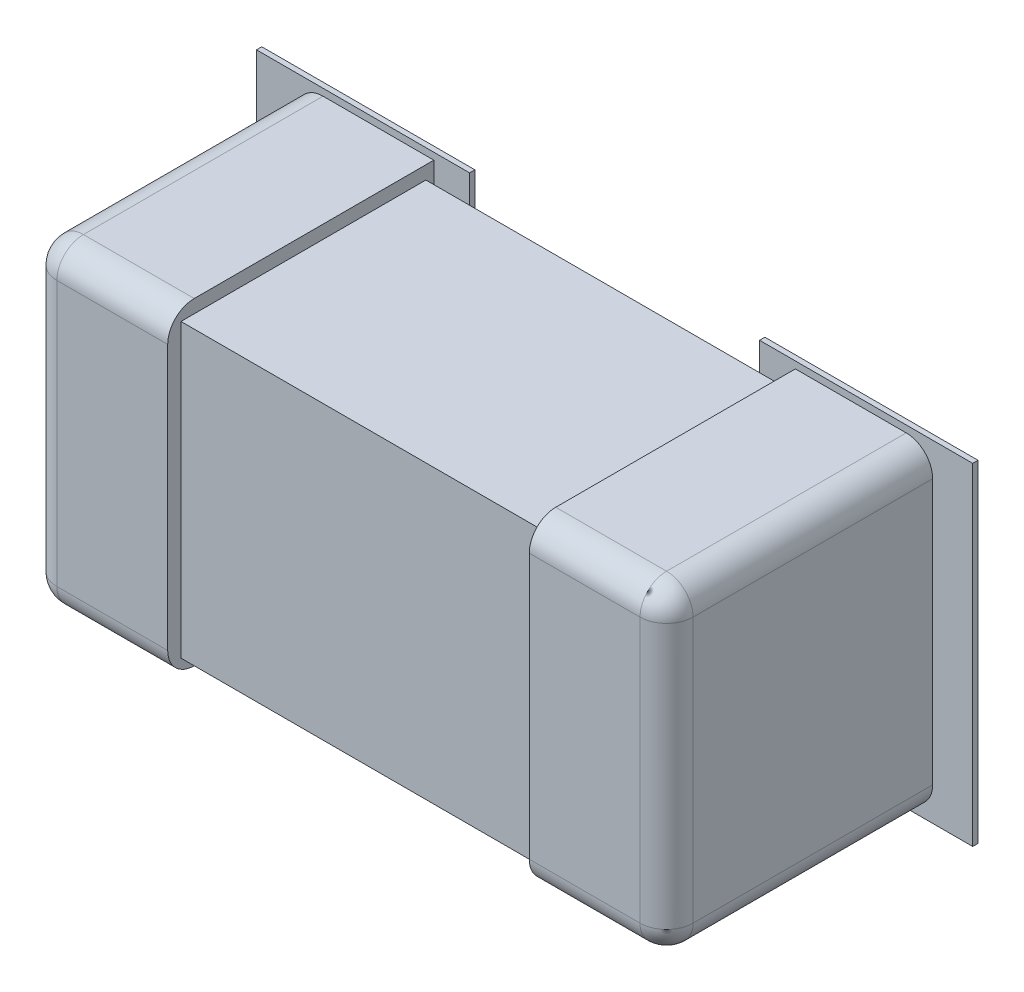
ISO-10303-21;
HEADER;
FILE_DESCRIPTION(('STEP AP214'),'2;1');
FILE_NAME('part.step','',(''),(''),'','','');
FILE_SCHEMA(('AUTOMOTIVE_DESIGN { 1 0 10303 214 1 1 1 1 }'));
ENDSEC;
DATA;
#1=APPLICATION_CONTEXT('core data for automotive mechanical design processes');
#2=APPLICATION_PROTOCOL_DEFINITION('international standard','automotive_design',2000,#1);
#3=PRODUCT_CONTEXT('',#1,'mechanical');
#4=PRODUCT('Part','Part','',(#3));
#5=PRODUCT_RELATED_PRODUCT_CATEGORY('part','',(#4));
#6=PRODUCT_DEFINITION_FORMATION('','',#4);
#7=PRODUCT_DEFINITION_CONTEXT('part definition',#1,'design');
#8=PRODUCT_DEFINITION('design','',#6,#7);
#9=PRODUCT_DEFINITION_SHAPE('','',#8);
#10=(LENGTH_UNIT() NAMED_UNIT(*) SI_UNIT(.MILLI.,.METRE.));
#11=(NAMED_UNIT(*) PLANE_ANGLE_UNIT() SI_UNIT($,.RADIAN.));
#12=(NAMED_UNIT(*) SI_UNIT($,.STERADIAN.) SOLID_ANGLE_UNIT());
#13=UNCERTAINTY_MEASURE_WITH_UNIT(LENGTH_MEASURE(1.E-05),#10,'distance_accuracy_value','');
#14=(GEOMETRIC_REPRESENTATION_CONTEXT(3) GLOBAL_UNCERTAINTY_ASSIGNED_CONTEXT((#13)) GLOBAL_UNIT_ASSIGNED_CONTEXT((#10,
#11,#12)) REPRESENTATION_CONTEXT('',''));
#15=CARTESIAN_POINT('',(0.,0.,0.));
#16=DIRECTION('',(0.,0.,1.));
#17=DIRECTION('',(1.,0.,0.));
#18=AXIS2_PLACEMENT_3D('',#15,#16,#17);
#19=CARTESIAN_POINT('',(0.,0.,0.0762));
#20=DIRECTION('',(0.,0.,1.));
#21=DIRECTION('',(1.,0.,0.));
#22=AXIS2_PLACEMENT_3D('',#19,#20,#21);
#23=PLANE('',#22);
#24=DIRECTION('',(1.,0.,0.));
#25=VECTOR('',#24,1.);
#26=CARTESIAN_POINT('',(0.138938,-0.159004,0.0762));
#27=LINE('',#26,#25);
#28=CARTESIAN_POINT('',(0.138938,-0.159004,0.0762));
#29=VERTEX_POINT('',#28);
#30=CARTESIAN_POINT('',(0.343154,-0.159004,0.0762));
#31=VERTEX_POINT('',#30);
#32=EDGE_CURVE('E341',#29,#31,#27,.T.);
#33=ORIENTED_EDGE('',*,*,#32,.F.);
#34=DIRECTION('',(0.,1.,0.));
#35=VECTOR('',#34,1.);
#36=CARTESIAN_POINT('',(0.138938,0.159004,0.0762));
#37=LINE('',#36,#35);
#38=CARTESIAN_POINT('',(0.138938,0.159004,0.0762));
#39=VERTEX_POINT('',#38);
#40=EDGE_CURVE('E347',#39,#29,#37,.F.);
#41=ORIENTED_EDGE('',*,*,#40,.F.);
#42=DIRECTION('',(1.,0.,0.));
#43=VECTOR('',#42,1.);
#44=CARTESIAN_POINT('',(0.343154,0.159004,0.0762));
#45=LINE('',#44,#43);
#46=CARTESIAN_POINT('',(0.343154,0.159004,0.0762));
#47=VERTEX_POINT('',#46);
#48=EDGE_CURVE('E326',#47,#39,#45,.F.);
#49=ORIENTED_EDGE('',*,*,#48,.F.);
#50=DIRECTION('',(0.,1.,0.));
#51=VECTOR('',#50,1.);
#52=CARTESIAN_POINT('',(0.343154,-0.159004,0.0762));
#53=LINE('',#52,#51);
#54=EDGE_CURVE('E335',#31,#47,#53,.T.);
#55=ORIENTED_EDGE('',*,*,#54,.F.);
#56=EDGE_LOOP('',(#33,#41,#49,#55));
#57=FACE_BOUND('',#56,.T.);
#58=ADVANCED_FACE('F17',(#57),#23,.F.);
#59=CARTESIAN_POINT('',(0.2794,0.127,0.310896));
#60=DIRECTION('',(0.,0.707106781186548,0.707106781186548));
#61=DIRECTION('',(1.,0.,0.));
#62=AXIS2_PLACEMENT_3D('',#59,#60,#61);
#63=SPHERICAL_SURFACE('',#62,0.0254);
#64=CARTESIAN_POINT('',(0.2794,0.127,0.310896));
#65=DIRECTION('',(-1.,0.,0.));
#66=DIRECTION('',(0.,0.,1.));
#67=AXIS2_PLACEMENT_3D('',#64,#65,#66);
#68=CIRCLE('',#67,0.0254);
#69=CARTESIAN_POINT('',(0.2794,0.127,0.336296));
#70=VERTEX_POINT('',#69);
#71=CARTESIAN_POINT('',(0.2794,0.144960512242138,0.328856512242138));
#72=VERTEX_POINT('',#71);
#73=EDGE_CURVE('E313',#70,#72,#68,.T.);
#74=ORIENTED_EDGE('',*,*,#73,.F.);
#75=CARTESIAN_POINT('',(0.2794,0.127,0.310896));
#76=DIRECTION('',(0.,1.,0.));
#77=DIRECTION('',(0.,0.,1.));
#78=AXIS2_PLACEMENT_3D('',#75,#76,#77);
#79=CIRCLE('',#78,0.0254);
#80=CARTESIAN_POINT('',(0.3048,0.127,0.310896));
#81=VERTEX_POINT('',#80);
#82=EDGE_CURVE('E319',#81,#70,#79,.F.);
#83=ORIENTED_EDGE('',*,*,#82,.F.);
#84=CARTESIAN_POINT('',(0.2794,0.127,0.310896));
#85=DIRECTION('',(0.,0.,-1.));
#86=DIRECTION('',(-1.,0.,0.));
#87=AXIS2_PLACEMENT_3D('',#84,#85,#86);
#88=CIRCLE('',#87,0.0254);
#89=CARTESIAN_POINT('',(0.2794,0.1524,0.310896));
#90=VERTEX_POINT('',#89);
#91=EDGE_CURVE('E20',#90,#81,#88,.T.);
#92=ORIENTED_EDGE('',*,*,#91,.F.);
#93=CARTESIAN_POINT('',(0.2794,0.127,0.310896));
#94=DIRECTION('',(-1.,0.,0.));
#95=DIRECTION('',(0.,0.,1.));
#96=AXIS2_PLACEMENT_3D('',#93,#94,#95);
#97=CIRCLE('',#96,0.0254);
#98=EDGE_CURVE('E56',#72,#90,#97,.T.);
#99=ORIENTED_EDGE('',*,*,#98,.F.);
#100=EDGE_LOOP('',(#74,#83,#92,#99));
#101=FACE_BOUND('',#100,.T.);
#102=ADVANCED_FACE('F373',(#101),#63,.T.);
#103=CARTESIAN_POINT('',(0.2794,-0.127,0.310896));
#104=DIRECTION('',(0.707106781186548,0.,0.707106781186548));
#105=DIRECTION('',(0.,-1.,0.));
#106=AXIS2_PLACEMENT_3D('',#103,#104,#105);
#107=SPHERICAL_SURFACE('',#106,0.0254);
#108=CARTESIAN_POINT('',(0.2794,-0.127,0.310896));
#109=DIRECTION('',(0.,1.,0.));
#110=DIRECTION('',(0.,0.,1.));
#111=AXIS2_PLACEMENT_3D('',#108,#109,#110);
#112=CIRCLE('',#111,0.0254);
#113=CARTESIAN_POINT('',(0.2794,-0.127,0.336296));
#114=VERTEX_POINT('',#113);
#115=CARTESIAN_POINT('',(0.297360512242138,-0.127,0.328856512242138));
#116=VERTEX_POINT('',#115);
#117=EDGE_CURVE('E35',#114,#116,#112,.T.);
#118=ORIENTED_EDGE('',*,*,#117,.F.);
#119=CARTESIAN_POINT('',(0.2794,-0.127,0.310896));
#120=DIRECTION('',(1.,0.,0.));
#121=DIRECTION('',(0.,0.,-1.));
#122=AXIS2_PLACEMENT_3D('',#119,#120,#121);
#123=CIRCLE('',#122,0.0254);
#124=CARTESIAN_POINT('',(0.2794,-0.1524,0.310896));
#125=VERTEX_POINT('',#124);
#126=EDGE_CURVE('E398',#125,#114,#123,.F.);
#127=ORIENTED_EDGE('',*,*,#126,.F.);
#128=CARTESIAN_POINT('',(0.2794,-0.127,0.310896));
#129=DIRECTION('',(0.,0.,-1.));
#130=DIRECTION('',(-1.,0.,0.));
#131=AXIS2_PLACEMENT_3D('',#128,#129,#130);
#132=CIRCLE('',#131,0.0254);
#133=CARTESIAN_POINT('',(0.3048,-0.127,0.310896));
#134=VERTEX_POINT('',#133);
#135=EDGE_CURVE('E323',#134,#125,#132,.T.);
#136=ORIENTED_EDGE('',*,*,#135,.F.);
#137=CARTESIAN_POINT('',(0.2794,-0.127,0.310896));
#138=DIRECTION('',(0.,1.,0.));
#139=DIRECTION('',(0.,0.,1.));
#140=AXIS2_PLACEMENT_3D('',#137,#138,#139);
#141=CIRCLE('',#140,0.0254);
#142=EDGE_CURVE('E318',#116,#134,#141,.T.);
#143=ORIENTED_EDGE('',*,*,#142,.F.);
#144=EDGE_LOOP('',(#118,#127,#136,#143));
#145=FACE_BOUND('',#144,.T.);
#146=ADVANCED_FACE('F369',(#145),#107,.T.);
#147=CARTESIAN_POINT('',(0.,0.,0.0762));
#148=DIRECTION('',(0.,0.,1.));
#149=DIRECTION('',(1.,0.,0.));
#150=AXIS2_PLACEMENT_3D('',#147,#148,#149);
#151=PLANE('',#150);
#152=DIRECTION('',(1.,0.,0.));
#153=VECTOR('',#152,1.);
#154=CARTESIAN_POINT('',(-0.138938,0.159004,0.0762));
#155=LINE('',#154,#153);
#156=CARTESIAN_POINT('',(-0.138938,0.159004,0.0762));
#157=VERTEX_POINT('',#156);
#158=CARTESIAN_POINT('',(-0.343154,0.159004,0.0762));
#159=VERTEX_POINT('',#158);
#160=EDGE_CURVE('E302',#157,#159,#155,.F.);
#161=ORIENTED_EDGE('',*,*,#160,.F.);
#162=DIRECTION('',(0.,1.,0.));
#163=VECTOR('',#162,1.);
#164=CARTESIAN_POINT('',(-0.138938,-0.159004,0.0762));
#165=LINE('',#164,#163);
#166=CARTESIAN_POINT('',(-0.138938,-0.159004,0.0762));
#167=VERTEX_POINT('',#166);
#168=EDGE_CURVE('E308',#167,#157,#165,.T.);
#169=ORIENTED_EDGE('',*,*,#168,.F.);
#170=DIRECTION('',(1.,0.,0.));
#171=VECTOR('',#170,1.);
#172=CARTESIAN_POINT('',(-0.343154,-0.159004,0.0762));
#173=LINE('',#172,#171);
#174=CARTESIAN_POINT('',(-0.343154,-0.159004,0.0762));
#175=VERTEX_POINT('',#174);
#176=EDGE_CURVE('E287',#175,#167,#173,.T.);
#177=ORIENTED_EDGE('',*,*,#176,.F.);
#178=DIRECTION('',(0.,1.,0.));
#179=VECTOR('',#178,1.);
#180=CARTESIAN_POINT('',(-0.343154,0.159004,0.0762));
#181=LINE('',#180,#179);
#182=EDGE_CURVE('E296',#159,#175,#181,.F.);
#183=ORIENTED_EDGE('',*,*,#182,.F.);
#184=EDGE_LOOP('',(#161,#169,#177,#183));
#185=FACE_BOUND('',#184,.T.);
#186=ADVANCED_FACE('F365',(#185),#151,.F.);
#187=CARTESIAN_POINT('',(-0.2794,-0.127,0.310896));
#188=DIRECTION('',(0.,-0.707106781186548,0.707106781186548));
#189=DIRECTION('',(-1.,0.,0.));
#190=AXIS2_PLACEMENT_3D('',#187,#188,#189);
#191=SPHERICAL_SURFACE('',#190,0.0254);
#192=CARTESIAN_POINT('',(-0.2794,-0.127,0.310896));
#193=DIRECTION('',(1.,0.,0.));
#194=DIRECTION('',(0.,0.,-1.));
#195=AXIS2_PLACEMENT_3D('',#192,#193,#194);
#196=CIRCLE('',#195,0.0254);
#197=CARTESIAN_POINT('',(-0.2794,-0.127,0.336296));
#198=VERTEX_POINT('',#197);
#199=CARTESIAN_POINT('',(-0.2794,-0.144960512242138,0.328856512242138));
#200=VERTEX_POINT('',#199);
#201=EDGE_CURVE('E271',#198,#200,#196,.T.);
#202=ORIENTED_EDGE('',*,*,#201,.F.);
#203=CARTESIAN_POINT('',(-0.2794,-0.127,0.310896));
#204=DIRECTION('',(0.,-1.,0.));
#205=DIRECTION('',(0.,0.,-1.));
#206=AXIS2_PLACEMENT_3D('',#203,#204,#205);
#207=CIRCLE('',#206,0.0254);
#208=CARTESIAN_POINT('',(-0.3048,-0.127,0.310896));
#209=VERTEX_POINT('',#208);
#210=EDGE_CURVE('E285',#209,#198,#207,.F.);
#211=ORIENTED_EDGE('',*,*,#210,.F.);
#212=CARTESIAN_POINT('',(-0.2794,-0.127,0.310896));
#213=DIRECTION('',(0.,0.,-1.));
#214=DIRECTION('',(-1.,0.,0.));
#215=AXIS2_PLACEMENT_3D('',#212,#213,#214);
#216=CIRCLE('',#215,0.0254);
#217=CARTESIAN_POINT('',(-0.2794,-0.1524,0.310896));
#218=VERTEX_POINT('',#217);
#219=EDGE_CURVE('E286',#218,#209,#216,.T.);
#220=ORIENTED_EDGE('',*,*,#219,.F.);
#221=CARTESIAN_POINT('',(-0.2794,-0.127,0.310896));
#222=DIRECTION('',(1.,0.,0.));
#223=DIRECTION('',(0.,0.,-1.));
#224=AXIS2_PLACEMENT_3D('',#221,#222,#223);
#225=CIRCLE('',#224,0.0254);
#226=EDGE_CURVE('E273',#200,#218,#225,.T.);
#227=ORIENTED_EDGE('',*,*,#226,.F.);
#228=EDGE_LOOP('',(#202,#211,#220,#227));
#229=FACE_BOUND('',#228,.T.);
#230=ADVANCED_FACE('F360',(#229),#191,.T.);
#231=CARTESIAN_POINT('',(-0.2794,0.127,0.310896));
#232=DIRECTION('',(-0.707106781186548,0.707106781186548,0.));
#233=DIRECTION('',(0.,0.,1.));
#234=AXIS2_PLACEMENT_3D('',#231,#232,#233);
#235=SPHERICAL_SURFACE('',#234,0.0254);
#236=CARTESIAN_POINT('',(-0.2794,0.127,0.310896));
#237=DIRECTION('',(0.,-1.,0.));
#238=DIRECTION('',(0.,0.,-1.));
#239=AXIS2_PLACEMENT_3D('',#236,#237,#238);
#240=CIRCLE('',#239,0.0254);
#241=CARTESIAN_POINT('',(-0.2794,0.127,0.336296));
#242=VERTEX_POINT('',#241);
#243=CARTESIAN_POINT('',(-0.3048,0.127,0.310896));
#244=VERTEX_POINT('',#243);
#245=EDGE_CURVE('E393',#242,#244,#240,.T.);
#246=ORIENTED_EDGE('',*,*,#245,.F.);
#247=CARTESIAN_POINT('',(-0.2794,0.127,0.310896));
#248=DIRECTION('',(-1.,0.,0.));
#249=DIRECTION('',(0.,0.,1.));
#250=AXIS2_PLACEMENT_3D('',#247,#248,#249);
#251=CIRCLE('',#250,0.0254);
#252=CARTESIAN_POINT('',(-0.2794,0.1524,0.310896));
#253=VERTEX_POINT('',#252);
#254=EDGE_CURVE('E388',#253,#242,#251,.F.);
#255=ORIENTED_EDGE('',*,*,#254,.F.);
#256=CARTESIAN_POINT('',(-0.2794,0.127,0.310896));
#257=DIRECTION('',(0.,0.,-1.));
#258=DIRECTION('',(-1.,0.,0.));
#259=AXIS2_PLACEMENT_3D('',#256,#257,#258);
#260=CIRCLE('',#259,0.0254);
#261=CARTESIAN_POINT('',(-0.297360512242138,0.144960512242138,0.310896));
#262=VERTEX_POINT('',#261);
#263=EDGE_CURVE('E269',#262,#253,#260,.T.);
#264=ORIENTED_EDGE('',*,*,#263,.F.);
#265=CARTESIAN_POINT('',(-0.2794,0.127,0.310896));
#266=DIRECTION('',(0.,0.,-1.));
#267=DIRECTION('',(-1.,0.,0.));
#268=AXIS2_PLACEMENT_3D('',#265,#266,#267);
#269=CIRCLE('',#268,0.0254);
#270=EDGE_CURVE('E267',#244,#262,#269,.T.);
#271=ORIENTED_EDGE('',*,*,#270,.F.);
#272=EDGE_LOOP('',(#246,#255,#264,#271));
#273=FACE_BOUND('',#272,.T.);
#274=ADVANCED_FACE('F355',(#273),#235,.T.);
#275=CARTESIAN_POINT('',(0.138938,0.159004,0.0762));
#276=DIRECTION('',(-1.,0.,0.));
#277=DIRECTION('',(0.,0.,1.));
#278=AXIS2_PLACEMENT_3D('',#275,#276,#277);
#279=PLANE('',#278);
#280=DIRECTION('',(0.,0.,1.));
#281=VECTOR('',#280,1.);
#282=CARTESIAN_POINT('',(0.138938,0.159004,0.0762));
#283=LINE('',#282,#281);
#284=CARTESIAN_POINT('',(0.138938,0.159004,0.08128));
#285=VERTEX_POINT('',#284);
#286=EDGE_CURVE('E332',#39,#285,#283,.T.);
#287=ORIENTED_EDGE('',*,*,#286,.F.);
#288=ORIENTED_EDGE('',*,*,#40,.T.);
#289=DIRECTION('',(0.,0.,-1.));
#290=VECTOR('',#289,1.);
#291=CARTESIAN_POINT('',(0.138938,-0.159004,0.0762));
#292=LINE('',#291,#290);
#293=CARTESIAN_POINT('',(0.138938,-0.159004,0.08128));
#294=VERTEX_POINT('',#293);
#295=EDGE_CURVE('E344',#294,#29,#292,.T.);
#296=ORIENTED_EDGE('',*,*,#295,.F.);
#297=DIRECTION('',(0.,1.,0.));
#298=VECTOR('',#297,1.);
#299=CARTESIAN_POINT('',(0.138938,0.,0.08128));
#300=LINE('',#299,#298);
#301=EDGE_CURVE('E261',#285,#294,#300,.F.);
#302=ORIENTED_EDGE('',*,*,#301,.F.);
#303=EDGE_LOOP('',(#287,#288,#296,#302));
#304=FACE_BOUND('',#303,.T.);
#305=ADVANCED_FACE('F359',(#304),#279,.T.);
#306=CARTESIAN_POINT('',(0.138938,-0.159004,0.0762));
#307=DIRECTION('',(0.,-1.,0.));
#308=DIRECTION('',(0.,0.,-1.));
#309=AXIS2_PLACEMENT_3D('',#306,#307,#308);
#310=PLANE('',#309);
#311=ORIENTED_EDGE('',*,*,#295,.T.);
#312=ORIENTED_EDGE('',*,*,#32,.T.);
#313=DIRECTION('',(0.,0.,-1.));
#314=VECTOR('',#313,1.);
#315=CARTESIAN_POINT('',(0.343154,-0.159004,0.0762));
#316=LINE('',#315,#314);
#317=CARTESIAN_POINT('',(0.343154,-0.159004,0.08128));
#318=VERTEX_POINT('',#317);
#319=EDGE_CURVE('E338',#318,#31,#316,.T.);
#320=ORIENTED_EDGE('',*,*,#319,.F.);
#321=DIRECTION('',(1.,0.,0.));
#322=VECTOR('',#321,1.);
#323=CARTESIAN_POINT('',(0.,-0.159004,0.08128));
#324=LINE('',#323,#322);
#325=EDGE_CURVE('E258',#294,#318,#324,.T.);
#326=ORIENTED_EDGE('',*,*,#325,.F.);
#327=EDGE_LOOP('',(#311,#312,#320,#326));
#328=FACE_BOUND('',#327,.T.);
#329=ADVANCED_FACE('F529',(#328),#310,.T.);
#330=CARTESIAN_POINT('',(0.343154,-0.159004,0.0762));
#331=DIRECTION('',(1.,0.,0.));
#332=DIRECTION('',(0.,0.,-1.));
#333=AXIS2_PLACEMENT_3D('',#330,#331,#332);
#334=PLANE('',#333);
#335=ORIENTED_EDGE('',*,*,#319,.T.);
#336=ORIENTED_EDGE('',*,*,#54,.T.);
#337=DIRECTION('',(0.,0.,1.));
#338=VECTOR('',#337,1.);
#339=CARTESIAN_POINT('',(0.343154,0.159004,0.0762));
#340=LINE('',#339,#338);
#341=CARTESIAN_POINT('',(0.343154,0.159004,0.08128));
#342=VERTEX_POINT('',#341);
#343=EDGE_CURVE('E329',#342,#47,#340,.F.);
#344=ORIENTED_EDGE('',*,*,#343,.F.);
#345=DIRECTION('',(0.,1.,0.));
#346=VECTOR('',#345,1.);
#347=CARTESIAN_POINT('',(0.343154,0.,0.08128));
#348=LINE('',#347,#346);
#349=EDGE_CURVE('E255',#318,#342,#348,.T.);
#350=ORIENTED_EDGE('',*,*,#349,.F.);
#351=EDGE_LOOP('',(#335,#336,#344,#350));
#352=FACE_BOUND('',#351,.T.);
#353=ADVANCED_FACE('F531',(#352),#334,.T.);
#354=CARTESIAN_POINT('',(0.343154,0.159004,0.0762));
#355=DIRECTION('',(0.,1.,0.));
#356=DIRECTION('',(0.,0.,1.));
#357=AXIS2_PLACEMENT_3D('',#354,#355,#356);
#358=PLANE('',#357);
#359=ORIENTED_EDGE('',*,*,#343,.T.);
#360=ORIENTED_EDGE('',*,*,#48,.T.);
#361=ORIENTED_EDGE('',*,*,#286,.T.);
#362=DIRECTION('',(1.,0.,0.));
#363=VECTOR('',#362,1.);
#364=CARTESIAN_POINT('',(0.,0.159004,0.08128));
#365=LINE('',#364,#363);
#366=EDGE_CURVE('E252',#342,#285,#365,.F.);
#367=ORIENTED_EDGE('',*,*,#366,.F.);
#368=EDGE_LOOP('',(#359,#360,#361,#367));
#369=FACE_BOUND('',#368,.T.);
#370=ADVANCED_FACE('F533',(#369),#358,.T.);
#371=CARTESIAN_POINT('',(0.3048,-0.1524,0.0762));
#372=DIRECTION('',(1.,0.,0.));
#373=DIRECTION('',(0.,0.,-1.));
#374=AXIS2_PLACEMENT_3D('',#371,#372,#373);
#375=PLANE('',#374);
#376=DIRECTION('',(0.,0.,-1.));
#377=VECTOR('',#376,1.);
#378=CARTESIAN_POINT('',(0.3048,-0.127,0.6753571456));
#379=LINE('',#378,#377);
#380=CARTESIAN_POINT('',(0.3048,-0.127,0.08128));
#381=VERTEX_POINT('',#380);
#382=EDGE_CURVE('E148',#381,#134,#379,.F.);
#383=ORIENTED_EDGE('',*,*,#382,.F.);
#384=DIRECTION('',(0.,1.,0.));
#385=VECTOR('',#384,1.);
#386=CARTESIAN_POINT('',(0.3048,0.,0.08128));
#387=LINE('',#386,#385);
#388=CARTESIAN_POINT('',(0.3048,0.127,0.08128));
#389=VERTEX_POINT('',#388);
#390=EDGE_CURVE('E67',#389,#381,#387,.F.);
#391=ORIENTED_EDGE('',*,*,#390,.F.);
#392=DIRECTION('',(0.,0.,-1.));
#393=VECTOR('',#392,1.);
#394=CARTESIAN_POINT('',(0.3048,0.127,0.6753571456));
#395=LINE('',#394,#393);
#396=EDGE_CURVE('E324',#81,#389,#395,.T.);
#397=ORIENTED_EDGE('',*,*,#396,.F.);
#398=DIRECTION('',(0.,1.,0.));
#399=VECTOR('',#398,1.);
#400=CARTESIAN_POINT('',(0.3048,-0.5735592288,0.310896));
#401=LINE('',#400,#399);
#402=EDGE_CURVE('E315',#134,#81,#401,.T.);
#403=ORIENTED_EDGE('',*,*,#402,.F.);
#404=EDGE_LOOP('',(#383,#391,#397,#403));
#405=FACE_BOUND('',#404,.T.);
#406=ADVANCED_FACE('F436',(#405),#375,.T.);
#407=CARTESIAN_POINT('',(0.2794,0.127,0.6753571456));
#408=DIRECTION('',(0.,0.,-1.));
#409=DIRECTION('',(-1.,0.,0.));
#410=AXIS2_PLACEMENT_3D('',#407,#408,#409);
#411=CYLINDRICAL_SURFACE('',#410,0.0254);
#412=ORIENTED_EDGE('',*,*,#396,.T.);
#413=CARTESIAN_POINT('',(0.2794,0.127,0.08128));
#414=DIRECTION('',(0.,0.,-1.));
#415=DIRECTION('',(-1.,0.,0.));
#416=AXIS2_PLACEMENT_3D('',#413,#414,#415);
#417=CIRCLE('',#416,0.0254);
#418=CARTESIAN_POINT('',(0.2794,0.1524,0.08128));
#419=VERTEX_POINT('',#418);
#420=EDGE_CURVE('E251',#419,#389,#417,.T.);
#421=ORIENTED_EDGE('',*,*,#420,.F.);
#422=DIRECTION('',(0.,0.,1.));
#423=VECTOR('',#422,1.);
#424=CARTESIAN_POINT('',(0.2794,0.1524,0.0762));
#425=LINE('',#424,#423);
#426=EDGE_CURVE('E244',#90,#419,#425,.F.);
#427=ORIENTED_EDGE('',*,*,#426,.F.);
#428=ORIENTED_EDGE('',*,*,#91,.T.);
#429=EDGE_LOOP('',(#412,#421,#427,#428));
#430=FACE_BOUND('',#429,.T.);
#431=ADVANCED_FACE('F414',(#430),#411,.T.);
#432=CARTESIAN_POINT('',(0.2794,-0.5735592288,0.310896));
#433=DIRECTION('',(0.,1.,0.));
#434=DIRECTION('',(0.,0.,1.));
#435=AXIS2_PLACEMENT_3D('',#432,#433,#434);
#436=CYLINDRICAL_SURFACE('',#435,0.0254);
#437=ORIENTED_EDGE('',*,*,#142,.T.);
#438=ORIENTED_EDGE('',*,*,#402,.T.);
#439=ORIENTED_EDGE('',*,*,#82,.T.);
#440=DIRECTION('',(0.,1.,0.));
#441=VECTOR('',#440,1.);
#442=CARTESIAN_POINT('',(0.2794,0.,0.336296));
#443=LINE('',#442,#441);
#444=EDGE_CURVE('E156',#114,#70,#443,.T.);
#445=ORIENTED_EDGE('',*,*,#444,.F.);
#446=ORIENTED_EDGE('',*,*,#117,.T.);
#447=EDGE_LOOP('',(#437,#438,#439,#445,#446));
#448=FACE_BOUND('',#447,.T.);
#449=ADVANCED_FACE('F405',(#448),#436,.T.);
#450=CARTESIAN_POINT('',(1.2378251088,0.127,0.310896));
#451=DIRECTION('',(-1.,0.,0.));
#452=DIRECTION('',(0.,0.,1.));
#453=AXIS2_PLACEMENT_3D('',#450,#451,#452);
#454=CYLINDRICAL_SURFACE('',#453,0.0254);
#455=DIRECTION('',(1.,0.,0.));
#456=VECTOR('',#455,1.);
#457=CARTESIAN_POINT('',(0.3048,0.1524,0.310896));
#458=LINE('',#457,#456);
#459=CARTESIAN_POINT('',(0.173228,0.1524,0.310896));
#460=VERTEX_POINT('',#459);
#461=EDGE_CURVE('E143',#460,#90,#458,.T.);
#462=ORIENTED_EDGE('',*,*,#461,.F.);
#463=CARTESIAN_POINT('',(0.173228,0.127,0.310896));
#464=DIRECTION('',(-1.,0.,0.));
#465=DIRECTION('',(0.,0.,1.));
#466=AXIS2_PLACEMENT_3D('',#463,#464,#465);
#467=CIRCLE('',#466,0.0254);
#468=CARTESIAN_POINT('',(0.173228,0.127,0.336296));
#469=VERTEX_POINT('',#468);
#470=EDGE_CURVE('E139',#460,#469,#467,.F.);
#471=ORIENTED_EDGE('',*,*,#470,.T.);
#472=DIRECTION('',(1.,0.,0.));
#473=VECTOR('',#472,1.);
#474=CARTESIAN_POINT('',(0.,0.127,0.336296));
#475=LINE('',#474,#473);
#476=EDGE_CURVE('E142',#70,#469,#475,.F.);
#477=ORIENTED_EDGE('',*,*,#476,.F.);
#478=ORIENTED_EDGE('',*,*,#73,.T.);
#479=ORIENTED_EDGE('',*,*,#98,.T.);
#480=EDGE_LOOP('',(#462,#471,#477,#478,#479));
#481=FACE_BOUND('',#480,.T.);
#482=ADVANCED_FACE('F141',(#481),#454,.T.);
#483=CARTESIAN_POINT('',(0.2794,-0.127,0.6753571456));
#484=DIRECTION('',(0.,0.,-1.));
#485=DIRECTION('',(-1.,0.,0.));
#486=AXIS2_PLACEMENT_3D('',#483,#484,#485);
#487=CYLINDRICAL_SURFACE('',#486,0.0254);
#488=DIRECTION('',(0.,0.,-1.));
#489=VECTOR('',#488,1.);
#490=CARTESIAN_POINT('',(0.2794,-0.1524,0.0762));
#491=LINE('',#490,#489);
#492=CARTESIAN_POINT('',(0.2794,-0.1524,0.08128));
#493=VERTEX_POINT('',#492);
#494=EDGE_CURVE('E157',#493,#125,#491,.F.);
#495=ORIENTED_EDGE('',*,*,#494,.F.);
#496=CARTESIAN_POINT('',(0.2794,-0.127,0.08128));
#497=DIRECTION('',(0.,0.,-1.));
#498=DIRECTION('',(-1.,0.,0.));
#499=AXIS2_PLACEMENT_3D('',#496,#497,#498);
#500=CIRCLE('',#499,0.0254);
#501=EDGE_CURVE('E245',#381,#493,#500,.T.);
#502=ORIENTED_EDGE('',*,*,#501,.F.);
#503=ORIENTED_EDGE('',*,*,#382,.T.);
#504=ORIENTED_EDGE('',*,*,#135,.T.);
#505=EDGE_LOOP('',(#495,#502,#503,#504));
#506=FACE_BOUND('',#505,.T.);
#507=ADVANCED_FACE('F434',(#506),#487,.T.);
#508=CARTESIAN_POINT('',(-1.2378251088,-0.127,0.310896));
#509=DIRECTION('',(1.,0.,0.));
#510=DIRECTION('',(0.,0.,-1.));
#511=AXIS2_PLACEMENT_3D('',#508,#509,#510);
#512=CYLINDRICAL_SURFACE('',#511,0.0254);
#513=DIRECTION('',(1.,0.,0.));
#514=VECTOR('',#513,1.);
#515=CARTESIAN_POINT('',(0.,-0.127,0.336296));
#516=LINE('',#515,#514);
#517=CARTESIAN_POINT('',(0.173228,-0.127,0.336296));
#518=VERTEX_POINT('',#517);
#519=EDGE_CURVE('E240',#518,#114,#516,.T.);
#520=ORIENTED_EDGE('',*,*,#519,.F.);
#521=CARTESIAN_POINT('',(0.173228,-0.127,0.310896));
#522=DIRECTION('',(1.,0.,0.));
#523=DIRECTION('',(0.,0.,-1.));
#524=AXIS2_PLACEMENT_3D('',#521,#522,#523);
#525=CIRCLE('',#524,0.0254);
#526=CARTESIAN_POINT('',(0.173228,-0.1524,0.310896));
#527=VERTEX_POINT('',#526);
#528=EDGE_CURVE('E161',#518,#527,#525,.T.);
#529=ORIENTED_EDGE('',*,*,#528,.T.);
#530=DIRECTION('',(1.,0.,0.));
#531=VECTOR('',#530,1.);
#532=CARTESIAN_POINT('',(-0.3048,-0.1524,0.310896));
#533=LINE('',#532,#531);
#534=EDGE_CURVE('E229',#125,#527,#533,.F.);
#535=ORIENTED_EDGE('',*,*,#534,.F.);
#536=ORIENTED_EDGE('',*,*,#126,.T.);
#537=EDGE_LOOP('',(#520,#529,#535,#536));
#538=FACE_BOUND('',#537,.T.);
#539=ADVANCED_FACE('F431',(#538),#512,.T.);
#540=CARTESIAN_POINT('',(-0.138938,-0.159004,0.0762));
#541=DIRECTION('',(1.,0.,0.));
#542=DIRECTION('',(0.,0.,-1.));
#543=AXIS2_PLACEMENT_3D('',#540,#541,#542);
#544=PLANE('',#543);
#545=DIRECTION('',(0.,0.,-1.));
#546=VECTOR('',#545,1.);
#547=CARTESIAN_POINT('',(-0.138938,-0.159004,0.0762));
#548=LINE('',#547,#546);
#549=CARTESIAN_POINT('',(-0.138938,-0.159004,0.08128));
#550=VERTEX_POINT('',#549);
#551=EDGE_CURVE('E293',#167,#550,#548,.F.);
#552=ORIENTED_EDGE('',*,*,#551,.F.);
#553=ORIENTED_EDGE('',*,*,#168,.T.);
#554=DIRECTION('',(0.,0.,1.));
#555=VECTOR('',#554,1.);
#556=CARTESIAN_POINT('',(-0.138938,0.159004,0.0762));
#557=LINE('',#556,#555);
#558=CARTESIAN_POINT('',(-0.138938,0.159004,0.08128));
#559=VERTEX_POINT('',#558);
#560=EDGE_CURVE('E305',#559,#157,#557,.F.);
#561=ORIENTED_EDGE('',*,*,#560,.F.);
#562=DIRECTION('',(0.,1.,0.));
#563=VECTOR('',#562,1.);
#564=CARTESIAN_POINT('',(-0.138938,0.,0.08128));
#565=LINE('',#564,#563);
#566=EDGE_CURVE('E225',#550,#559,#565,.T.);
#567=ORIENTED_EDGE('',*,*,#566,.F.);
#568=EDGE_LOOP('',(#552,#553,#561,#567));
#569=FACE_BOUND('',#568,.T.);
#570=ADVANCED_FACE('F493',(#569),#544,.T.);
#571=CARTESIAN_POINT('',(-0.138938,0.159004,0.0762));
#572=DIRECTION('',(0.,1.,0.));
#573=DIRECTION('',(0.,0.,1.));
#574=AXIS2_PLACEMENT_3D('',#571,#572,#573);
#575=PLANE('',#574);
#576=ORIENTED_EDGE('',*,*,#560,.T.);
#577=ORIENTED_EDGE('',*,*,#160,.T.);
#578=DIRECTION('',(0.,0.,1.));
#579=VECTOR('',#578,1.);
#580=CARTESIAN_POINT('',(-0.343154,0.159004,0.0762));
#581=LINE('',#580,#579);
#582=CARTESIAN_POINT('',(-0.343154,0.159004,0.08128));
#583=VERTEX_POINT('',#582);
#584=EDGE_CURVE('E299',#583,#159,#581,.F.);
#585=ORIENTED_EDGE('',*,*,#584,.F.);
#586=DIRECTION('',(1.,0.,0.));
#587=VECTOR('',#586,1.);
#588=CARTESIAN_POINT('',(0.,0.159004,0.08128));
#589=LINE('',#588,#587);
#590=EDGE_CURVE('E222',#559,#583,#589,.F.);
#591=ORIENTED_EDGE('',*,*,#590,.F.);
#592=EDGE_LOOP('',(#576,#577,#585,#591));
#593=FACE_BOUND('',#592,.T.);
#594=ADVANCED_FACE('F500',(#593),#575,.T.);
#595=CARTESIAN_POINT('',(-0.343154,0.159004,0.0762));
#596=DIRECTION('',(-1.,0.,0.));
#597=DIRECTION('',(0.,0.,1.));
#598=AXIS2_PLACEMENT_3D('',#595,#596,#597);
#599=PLANE('',#598);
#600=ORIENTED_EDGE('',*,*,#584,.T.);
#601=ORIENTED_EDGE('',*,*,#182,.T.);
#602=DIRECTION('',(0.,0.,-1.));
#603=VECTOR('',#602,1.);
#604=CARTESIAN_POINT('',(-0.343154,-0.159004,0.0762));
#605=LINE('',#604,#603);
#606=CARTESIAN_POINT('',(-0.343154,-0.159004,0.08128));
#607=VERTEX_POINT('',#606);
#608=EDGE_CURVE('E290',#607,#175,#605,.T.);
#609=ORIENTED_EDGE('',*,*,#608,.F.);
#610=DIRECTION('',(0.,1.,0.));
#611=VECTOR('',#610,1.);
#612=CARTESIAN_POINT('',(-0.343154,0.,0.08128));
#613=LINE('',#612,#611);
#614=EDGE_CURVE('E219',#583,#607,#613,.F.);
#615=ORIENTED_EDGE('',*,*,#614,.F.);
#616=EDGE_LOOP('',(#600,#601,#609,#615));
#617=FACE_BOUND('',#616,.T.);
#618=ADVANCED_FACE('F505',(#617),#599,.T.);
#619=CARTESIAN_POINT('',(-0.343154,-0.159004,0.0762));
#620=DIRECTION('',(0.,-1.,0.));
#621=DIRECTION('',(0.,0.,-1.));
#622=AXIS2_PLACEMENT_3D('',#619,#620,#621);
#623=PLANE('',#622);
#624=ORIENTED_EDGE('',*,*,#608,.T.);
#625=ORIENTED_EDGE('',*,*,#176,.T.);
#626=ORIENTED_EDGE('',*,*,#551,.T.);
#627=DIRECTION('',(1.,0.,0.));
#628=VECTOR('',#627,1.);
#629=CARTESIAN_POINT('',(0.,-0.159004,0.08128));
#630=LINE('',#629,#628);
#631=EDGE_CURVE('E216',#607,#550,#630,.T.);
#632=ORIENTED_EDGE('',*,*,#631,.F.);
#633=EDGE_LOOP('',(#624,#625,#626,#632));
#634=FACE_BOUND('',#633,.T.);
#635=ADVANCED_FACE('F510',(#634),#623,.T.);
#636=CARTESIAN_POINT('',(-0.3048,0.1524,0.0762));
#637=DIRECTION('',(-1.,0.,0.));
#638=DIRECTION('',(0.,0.,1.));
#639=AXIS2_PLACEMENT_3D('',#636,#637,#638);
#640=PLANE('',#639);
#641=DIRECTION('',(0.,0.,-1.));
#642=VECTOR('',#641,1.);
#643=CARTESIAN_POINT('',(-0.3048,0.127,0.6753571456));
#644=LINE('',#643,#642);
#645=CARTESIAN_POINT('',(-0.3048,0.127,0.08128));
#646=VERTEX_POINT('',#645);
#647=EDGE_CURVE('E270',#646,#244,#644,.F.);
#648=ORIENTED_EDGE('',*,*,#647,.F.);
#649=DIRECTION('',(0.,1.,0.));
#650=VECTOR('',#649,1.);
#651=CARTESIAN_POINT('',(-0.3048,0.,0.08128));
#652=LINE('',#651,#650);
#653=CARTESIAN_POINT('',(-0.3048,-0.127,0.08128));
#654=VERTEX_POINT('',#653);
#655=EDGE_CURVE('E212',#654,#646,#652,.T.);
#656=ORIENTED_EDGE('',*,*,#655,.F.);
#657=DIRECTION('',(0.,0.,-1.));
#658=VECTOR('',#657,1.);
#659=CARTESIAN_POINT('',(-0.3048,-0.127,0.6753571456));
#660=LINE('',#659,#658);
#661=EDGE_CURVE('E282',#209,#654,#660,.T.);
#662=ORIENTED_EDGE('',*,*,#661,.F.);
#663=DIRECTION('',(0.,-1.,0.));
#664=VECTOR('',#663,1.);
#665=CARTESIAN_POINT('',(-0.3048,0.5735592288,0.310896));
#666=LINE('',#665,#664);
#667=EDGE_CURVE('E274',#244,#209,#666,.T.);
#668=ORIENTED_EDGE('',*,*,#667,.F.);
#669=EDGE_LOOP('',(#648,#656,#662,#668));
#670=FACE_BOUND('',#669,.T.);
#671=ADVANCED_FACE('F607',(#670),#640,.T.);
#672=CARTESIAN_POINT('',(-0.2794,-0.127,0.6753571456));
#673=DIRECTION('',(0.,0.,-1.));
#674=DIRECTION('',(-1.,0.,0.));
#675=AXIS2_PLACEMENT_3D('',#672,#673,#674);
#676=CYLINDRICAL_SURFACE('',#675,0.0254);
#677=ORIENTED_EDGE('',*,*,#661,.T.);
#678=CARTESIAN_POINT('',(-0.2794,-0.127,0.08128));
#679=DIRECTION('',(0.,0.,-1.));
#680=DIRECTION('',(-1.,0.,0.));
#681=AXIS2_PLACEMENT_3D('',#678,#679,#680);
#682=CIRCLE('',#681,0.0254);
#683=CARTESIAN_POINT('',(-0.2794,-0.1524,0.08128));
#684=VERTEX_POINT('',#683);
#685=EDGE_CURVE('E215',#684,#654,#682,.T.);
#686=ORIENTED_EDGE('',*,*,#685,.F.);
#687=DIRECTION('',(0.,0.,-1.));
#688=VECTOR('',#687,1.);
#689=CARTESIAN_POINT('',(-0.2794,-0.1524,0.0762));
#690=LINE('',#689,#688);
#691=EDGE_CURVE('E206',#218,#684,#690,.T.);
#692=ORIENTED_EDGE('',*,*,#691,.F.);
#693=ORIENTED_EDGE('',*,*,#219,.T.);
#694=EDGE_LOOP('',(#677,#686,#692,#693));
#695=FACE_BOUND('',#694,.T.);
#696=ADVANCED_FACE('F461',(#695),#676,.T.);
#697=CARTESIAN_POINT('',(-0.2794,0.5735592288,0.310896));
#698=DIRECTION('',(0.,-1.,0.));
#699=DIRECTION('',(0.,0.,-1.));
#700=AXIS2_PLACEMENT_3D('',#697,#698,#699);
#701=CYLINDRICAL_SURFACE('',#700,0.0254);
#702=ORIENTED_EDGE('',*,*,#245,.T.);
#703=ORIENTED_EDGE('',*,*,#667,.T.);
#704=ORIENTED_EDGE('',*,*,#210,.T.);
#705=DIRECTION('',(0.,1.,0.));
#706=VECTOR('',#705,1.);
#707=CARTESIAN_POINT('',(-0.2794,0.,0.336296));
#708=LINE('',#707,#706);
#709=EDGE_CURVE('E198',#242,#198,#708,.F.);
#710=ORIENTED_EDGE('',*,*,#709,.F.);
#711=EDGE_LOOP('',(#702,#703,#704,#710));
#712=FACE_BOUND('',#711,.T.);
#713=ADVANCED_FACE('F600',(#712),#701,.T.);
#714=CARTESIAN_POINT('',(-1.2378251088,-0.127,0.310896));
#715=DIRECTION('',(1.,0.,0.));
#716=DIRECTION('',(0.,0.,-1.));
#717=AXIS2_PLACEMENT_3D('',#714,#715,#716);
#718=CYLINDRICAL_SURFACE('',#717,0.0254);
#719=DIRECTION('',(1.,0.,0.));
#720=VECTOR('',#719,1.);
#721=CARTESIAN_POINT('',(-0.3048,-0.1524,0.310896));
#722=LINE('',#721,#720);
#723=CARTESIAN_POINT('',(-0.173228,-0.1524,0.310896));
#724=VERTEX_POINT('',#723);
#725=EDGE_CURVE('E203',#724,#218,#722,.F.);
#726=ORIENTED_EDGE('',*,*,#725,.F.);
#727=CARTESIAN_POINT('',(-0.173228,-0.127,0.310896));
#728=DIRECTION('',(1.,0.,0.));
#729=DIRECTION('',(0.,0.,-1.));
#730=AXIS2_PLACEMENT_3D('',#727,#728,#729);
#731=CIRCLE('',#730,0.0254);
#732=CARTESIAN_POINT('',(-0.173228,-0.127,0.336296));
#733=VERTEX_POINT('',#732);
#734=EDGE_CURVE('E281',#724,#733,#731,.F.);
#735=ORIENTED_EDGE('',*,*,#734,.T.);
#736=DIRECTION('',(1.,0.,0.));
#737=VECTOR('',#736,1.);
#738=CARTESIAN_POINT('',(0.,-0.127,0.336296));
#739=LINE('',#738,#737);
#740=EDGE_CURVE('E195',#198,#733,#739,.T.);
#741=ORIENTED_EDGE('',*,*,#740,.F.);
#742=ORIENTED_EDGE('',*,*,#201,.T.);
#743=ORIENTED_EDGE('',*,*,#226,.T.);
#744=EDGE_LOOP('',(#726,#735,#741,#742,#743));
#745=FACE_BOUND('',#744,.T.);
#746=ADVANCED_FACE('F596',(#745),#718,.T.);
#747=CARTESIAN_POINT('',(-0.2794,0.127,0.6753571456));
#748=DIRECTION('',(0.,0.,-1.));
#749=DIRECTION('',(-1.,0.,0.));
#750=AXIS2_PLACEMENT_3D('',#747,#748,#749);
#751=CYLINDRICAL_SURFACE('',#750,0.0254);
#752=DIRECTION('',(0.,0.,1.));
#753=VECTOR('',#752,1.);
#754=CARTESIAN_POINT('',(-0.2794,0.1524,0.0762));
#755=LINE('',#754,#753);
#756=CARTESIAN_POINT('',(-0.2794,0.1524,0.08128));
#757=VERTEX_POINT('',#756);
#758=EDGE_CURVE('E183',#757,#253,#755,.T.);
#759=ORIENTED_EDGE('',*,*,#758,.F.);
#760=CARTESIAN_POINT('',(-0.2794,0.127,0.08128));
#761=DIRECTION('',(0.,0.,-1.));
#762=DIRECTION('',(-1.,0.,0.));
#763=AXIS2_PLACEMENT_3D('',#760,#761,#762);
#764=CIRCLE('',#763,0.0254);
#765=EDGE_CURVE('E207',#646,#757,#764,.T.);
#766=ORIENTED_EDGE('',*,*,#765,.F.);
#767=ORIENTED_EDGE('',*,*,#647,.T.);
#768=ORIENTED_EDGE('',*,*,#270,.T.);
#769=ORIENTED_EDGE('',*,*,#263,.T.);
#770=EDGE_LOOP('',(#759,#766,#767,#768,#769));
#771=FACE_BOUND('',#770,.T.);
#772=ADVANCED_FACE('F592',(#771),#751,.T.);
#773=CARTESIAN_POINT('',(1.2378251088,0.127,0.310896));
#774=DIRECTION('',(-1.,0.,0.));
#775=DIRECTION('',(0.,0.,1.));
#776=AXIS2_PLACEMENT_3D('',#773,#774,#775);
#777=CYLINDRICAL_SURFACE('',#776,0.0254);
#778=DIRECTION('',(1.,0.,0.));
#779=VECTOR('',#778,1.);
#780=CARTESIAN_POINT('',(0.,0.127,0.336296));
#781=LINE('',#780,#779);
#782=CARTESIAN_POINT('',(-0.173228,0.127,0.336296));
#783=VERTEX_POINT('',#782);
#784=EDGE_CURVE('E199',#783,#242,#781,.F.);
#785=ORIENTED_EDGE('',*,*,#784,.F.);
#786=CARTESIAN_POINT('',(-0.173228,0.127,0.310896));
#787=DIRECTION('',(-1.,0.,0.));
#788=DIRECTION('',(0.,0.,1.));
#789=AXIS2_PLACEMENT_3D('',#786,#787,#788);
#790=CIRCLE('',#789,0.0254);
#791=CARTESIAN_POINT('',(-0.173228,0.1524,0.310896));
#792=VERTEX_POINT('',#791);
#793=EDGE_CURVE('E264',#783,#792,#790,.T.);
#794=ORIENTED_EDGE('',*,*,#793,.T.);
#795=DIRECTION('',(1.,0.,0.));
#796=VECTOR('',#795,1.);
#797=CARTESIAN_POINT('',(0.3048,0.1524,0.310896));
#798=LINE('',#797,#796);
#799=EDGE_CURVE('E180',#253,#792,#798,.T.);
#800=ORIENTED_EDGE('',*,*,#799,.F.);
#801=ORIENTED_EDGE('',*,*,#254,.T.);
#802=EDGE_LOOP('',(#785,#794,#800,#801));
#803=FACE_BOUND('',#802,.T.);
#804=ADVANCED_FACE('F589',(#803),#777,.T.);
#805=CARTESIAN_POINT('',(0.,0.,0.08128));
#806=DIRECTION('',(0.,0.,1.));
#807=DIRECTION('',(1.,0.,0.));
#808=AXIS2_PLACEMENT_3D('',#805,#806,#807);
#809=PLANE('',#808);
#810=DIRECTION('',(0.,1.,0.));
#811=VECTOR('',#810,1.);
#812=CARTESIAN_POINT('',(0.173228,-0.1524,0.08128));
#813=LINE('',#812,#811);
#814=CARTESIAN_POINT('',(0.173228,-0.1524,0.08128));
#815=VERTEX_POINT('',#814);
#816=CARTESIAN_POINT('',(0.173228,0.1524,0.08128));
#817=VERTEX_POINT('',#816);
#818=EDGE_CURVE('E169',#815,#817,#813,.T.);
#819=ORIENTED_EDGE('',*,*,#818,.T.);
#820=DIRECTION('',(1.,0.,0.));
#821=VECTOR('',#820,1.);
#822=CARTESIAN_POINT('',(0.3048,0.1524,0.08128));
#823=LINE('',#822,#821);
#824=EDGE_CURVE('E242',#419,#817,#823,.F.);
#825=ORIENTED_EDGE('',*,*,#824,.F.);
#826=ORIENTED_EDGE('',*,*,#420,.T.);
#827=ORIENTED_EDGE('',*,*,#390,.T.);
#828=ORIENTED_EDGE('',*,*,#501,.T.);
#829=DIRECTION('',(1.,0.,0.));
#830=VECTOR('',#829,1.);
#831=CARTESIAN_POINT('',(-0.3048,-0.1524,0.08128));
#832=LINE('',#831,#830);
#833=EDGE_CURVE('E228',#815,#493,#832,.T.);
#834=ORIENTED_EDGE('',*,*,#833,.F.);
#835=EDGE_LOOP('',(#819,#825,#826,#827,#828,#834));
#836=FACE_BOUND('',#835,.T.);
#837=ORIENTED_EDGE('',*,*,#349,.T.);
#838=ORIENTED_EDGE('',*,*,#366,.T.);
#839=ORIENTED_EDGE('',*,*,#301,.T.);
#840=ORIENTED_EDGE('',*,*,#325,.T.);
#841=EDGE_LOOP('',(#837,#838,#839,#840));
#842=FACE_BOUND('',#841,.T.);
#843=ADVANCED_FACE('F421',(#836,#842),#809,.T.);
#844=CARTESIAN_POINT('',(0.3048,0.1524,0.0762));
#845=DIRECTION('',(0.,1.,0.));
#846=DIRECTION('',(0.,0.,1.));
#847=AXIS2_PLACEMENT_3D('',#844,#845,#846);
#848=PLANE('',#847);
#849=ORIENTED_EDGE('',*,*,#426,.T.);
#850=ORIENTED_EDGE('',*,*,#824,.T.);
#851=DIRECTION('',(0.,0.,-1.));
#852=VECTOR('',#851,1.);
#853=CARTESIAN_POINT('',(0.173228,0.1524,0.0889));
#854=LINE('',#853,#852);
#855=EDGE_CURVE('E164',#817,#460,#854,.F.);
#856=ORIENTED_EDGE('',*,*,#855,.T.);
#857=ORIENTED_EDGE('',*,*,#461,.T.);
#858=EDGE_LOOP('',(#849,#850,#856,#857));
#859=FACE_BOUND('',#858,.T.);
#860=ADVANCED_FACE('F417',(#859),#848,.T.);
#861=CARTESIAN_POINT('',(0.,0.,0.336296));
#862=DIRECTION('',(0.,0.,1.));
#863=DIRECTION('',(1.,0.,0.));
#864=AXIS2_PLACEMENT_3D('',#861,#862,#863);
#865=PLANE('',#864);
#866=ORIENTED_EDGE('',*,*,#444,.T.);
#867=ORIENTED_EDGE('',*,*,#476,.T.);
#868=DIRECTION('',(0.,1.,0.));
#869=VECTOR('',#868,1.);
#870=CARTESIAN_POINT('',(0.173228,-0.1524,0.336296));
#871=LINE('',#870,#869);
#872=EDGE_CURVE('E155',#469,#518,#871,.F.);
#873=ORIENTED_EDGE('',*,*,#872,.T.);
#874=ORIENTED_EDGE('',*,*,#519,.T.);
#875=EDGE_LOOP('',(#866,#867,#873,#874));
#876=FACE_BOUND('',#875,.T.);
#877=ADVANCED_FACE('F153',(#876),#865,.T.);
#878=CARTESIAN_POINT('',(-0.3048,-0.1524,0.0762));
#879=DIRECTION('',(0.,-1.,0.));
#880=DIRECTION('',(0.,0.,-1.));
#881=AXIS2_PLACEMENT_3D('',#878,#879,#880);
#882=PLANE('',#881);
#883=DIRECTION('',(0.,0.,-1.));
#884=VECTOR('',#883,1.);
#885=CARTESIAN_POINT('',(0.173228,-0.1524,0.0889));
#886=LINE('',#885,#884);
#887=EDGE_CURVE('E163',#527,#815,#886,.T.);
#888=ORIENTED_EDGE('',*,*,#887,.T.);
#889=ORIENTED_EDGE('',*,*,#833,.T.);
#890=ORIENTED_EDGE('',*,*,#494,.T.);
#891=ORIENTED_EDGE('',*,*,#534,.T.);
#892=EDGE_LOOP('',(#888,#889,#890,#891));
#893=FACE_BOUND('',#892,.T.);
#894=ADVANCED_FACE('F427',(#893),#882,.T.);
#895=CARTESIAN_POINT('',(0.,0.,0.08128));
#896=DIRECTION('',(0.,0.,1.));
#897=DIRECTION('',(1.,0.,0.));
#898=AXIS2_PLACEMENT_3D('',#895,#896,#897);
#899=PLANE('',#898);
#900=DIRECTION('',(0.,1.,0.));
#901=VECTOR('',#900,1.);
#902=CARTESIAN_POINT('',(-0.173228,-0.1524,0.08128));
#903=LINE('',#902,#901);
#904=CARTESIAN_POINT('',(-0.173228,0.1524,0.08128));
#905=VERTEX_POINT('',#904);
#906=CARTESIAN_POINT('',(-0.173228,-0.1524,0.08128));
#907=VERTEX_POINT('',#906);
#908=EDGE_CURVE('E188',#905,#907,#903,.F.);
#909=ORIENTED_EDGE('',*,*,#908,.T.);
#910=DIRECTION('',(1.,0.,0.));
#911=VECTOR('',#910,1.);
#912=CARTESIAN_POINT('',(-0.3048,-0.1524,0.08128));
#913=LINE('',#912,#911);
#914=EDGE_CURVE('E202',#684,#907,#913,.T.);
#915=ORIENTED_EDGE('',*,*,#914,.F.);
#916=ORIENTED_EDGE('',*,*,#685,.T.);
#917=ORIENTED_EDGE('',*,*,#655,.T.);
#918=ORIENTED_EDGE('',*,*,#765,.T.);
#919=DIRECTION('',(1.,0.,0.));
#920=VECTOR('',#919,1.);
#921=CARTESIAN_POINT('',(0.3048,0.1524,0.08128));
#922=LINE('',#921,#920);
#923=EDGE_CURVE('E179',#905,#757,#922,.F.);
#924=ORIENTED_EDGE('',*,*,#923,.F.);
#925=EDGE_LOOP('',(#909,#915,#916,#917,#918,#924));
#926=FACE_BOUND('',#925,.T.);
#927=ORIENTED_EDGE('',*,*,#614,.T.);
#928=ORIENTED_EDGE('',*,*,#631,.T.);
#929=ORIENTED_EDGE('',*,*,#566,.T.);
#930=ORIENTED_EDGE('',*,*,#590,.T.);
#931=EDGE_LOOP('',(#927,#928,#929,#930));
#932=FACE_BOUND('',#931,.T.);
#933=ADVANCED_FACE('F465',(#926,#932),#899,.T.);
#934=CARTESIAN_POINT('',(-0.3048,-0.1524,0.0762));
#935=DIRECTION('',(0.,-1.,0.));
#936=DIRECTION('',(0.,0.,-1.));
#937=AXIS2_PLACEMENT_3D('',#934,#935,#936);
#938=PLANE('',#937);
#939=ORIENTED_EDGE('',*,*,#691,.T.);
#940=ORIENTED_EDGE('',*,*,#914,.T.);
#941=DIRECTION('',(0.,0.,1.));
#942=VECTOR('',#941,1.);
#943=CARTESIAN_POINT('',(-0.173228,-0.1524,0.0762));
#944=LINE('',#943,#942);
#945=EDGE_CURVE('E191',#907,#724,#944,.T.);
#946=ORIENTED_EDGE('',*,*,#945,.T.);
#947=ORIENTED_EDGE('',*,*,#725,.T.);
#948=EDGE_LOOP('',(#939,#940,#946,#947));
#949=FACE_BOUND('',#948,.T.);
#950=ADVANCED_FACE('F454',(#949),#938,.T.);
#951=CARTESIAN_POINT('',(0.,0.,0.336296));
#952=DIRECTION('',(0.,0.,1.));
#953=DIRECTION('',(1.,0.,0.));
#954=AXIS2_PLACEMENT_3D('',#951,#952,#953);
#955=PLANE('',#954);
#956=ORIENTED_EDGE('',*,*,#709,.T.);
#957=ORIENTED_EDGE('',*,*,#740,.T.);
#958=DIRECTION('',(0.,1.,0.));
#959=VECTOR('',#958,1.);
#960=CARTESIAN_POINT('',(-0.173228,-0.1524,0.336296));
#961=LINE('',#960,#959);
#962=EDGE_CURVE('E927',#733,#783,#961,.T.);
#963=ORIENTED_EDGE('',*,*,#962,.T.);
#964=ORIENTED_EDGE('',*,*,#784,.T.);
#965=EDGE_LOOP('',(#956,#957,#963,#964));
#966=FACE_BOUND('',#965,.T.);
#967=ADVANCED_FACE('F572',(#966),#955,.T.);
#968=CARTESIAN_POINT('',(0.3048,0.1524,0.0762));
#969=DIRECTION('',(0.,1.,0.));
#970=DIRECTION('',(0.,0.,1.));
#971=AXIS2_PLACEMENT_3D('',#968,#969,#970);
#972=PLANE('',#971);
#973=DIRECTION('',(0.,0.,1.));
#974=VECTOR('',#973,1.);
#975=CARTESIAN_POINT('',(-0.173228,0.1524,0.0762));
#976=LINE('',#975,#974);
#977=EDGE_CURVE('E475',#792,#905,#976,.F.);
#978=ORIENTED_EDGE('',*,*,#977,.T.);
#979=ORIENTED_EDGE('',*,*,#923,.T.);
#980=ORIENTED_EDGE('',*,*,#758,.T.);
#981=ORIENTED_EDGE('',*,*,#799,.T.);
#982=EDGE_LOOP('',(#978,#979,#980,#981));
#983=FACE_BOUND('',#982,.T.);
#984=ADVANCED_FACE('F568',(#983),#972,.T.);
#985=CARTESIAN_POINT('',(-0.173228,0.1524,0.323596));
#986=DIRECTION('',(0.,0.,-1.));
#987=DIRECTION('',(-1.,0.,0.));
#988=AXIS2_PLACEMENT_3D('',#985,#986,#987);
#989=PLANE('',#988);
#990=DIRECTION('',(1.,0.,0.));
#991=VECTOR('',#990,1.);
#992=CARTESIAN_POINT('',(-0.173228,-0.1397,0.323596));
#993=LINE('',#992,#991);
#994=CARTESIAN_POINT('',(-0.173228,-0.1397,0.323596));
#995=VERTEX_POINT('',#994);
#996=CARTESIAN_POINT('',(0.173228,-0.1397,0.323596));
#997=VERTEX_POINT('',#996);
#998=EDGE_CURVE('E176',#995,#997,#993,.T.);
#999=ORIENTED_EDGE('',*,*,#998,.T.);
#1000=DIRECTION('',(0.,1.,0.));
#1001=VECTOR('',#1000,1.);
#1002=CARTESIAN_POINT('',(0.173228,-0.1524,0.323596));
#1003=LINE('',#1002,#1001);
#1004=CARTESIAN_POINT('',(0.173228,0.1397,0.323596));
#1005=VERTEX_POINT('',#1004);
#1006=EDGE_CURVE('E946',#997,#1005,#1003,.T.);
#1007=ORIENTED_EDGE('',*,*,#1006,.T.);
#1008=DIRECTION('',(1.,0.,0.));
#1009=VECTOR('',#1008,1.);
#1010=CARTESIAN_POINT('',(-0.173228,0.1397,0.323596));
#1011=LINE('',#1010,#1009);
#1012=CARTESIAN_POINT('',(-0.173228,0.1397,0.323596));
#1013=VERTEX_POINT('',#1012);
#1014=EDGE_CURVE('E192',#1005,#1013,#1011,.F.);
#1015=ORIENTED_EDGE('',*,*,#1014,.T.);
#1016=DIRECTION('',(0.,1.,0.));
#1017=VECTOR('',#1016,1.);
#1018=CARTESIAN_POINT('',(-0.173228,-0.1524,0.323596));
#1019=LINE('',#1018,#1017);
#1020=EDGE_CURVE('E968',#1013,#995,#1019,.F.);
#1021=ORIENTED_EDGE('',*,*,#1020,.T.);
#1022=EDGE_LOOP('',(#999,#1007,#1015,#1021));
#1023=FACE_BOUND('',#1022,.T.);
#1024=ADVANCED_FACE('F564',(#1023),#989,.F.);
#1025=CARTESIAN_POINT('',(-0.173228,-0.1397,0.336296));
#1026=DIRECTION('',(0.,1.,0.));
#1027=DIRECTION('',(0.,0.,1.));
#1028=AXIS2_PLACEMENT_3D('',#1025,#1026,#1027);
#1029=PLANE('',#1028);
#1030=DIRECTION('',(1.,0.,0.));
#1031=VECTOR('',#1030,1.);
#1032=CARTESIAN_POINT('',(-0.173228,-0.1397,0.0889));
#1033=LINE('',#1032,#1031);
#1034=CARTESIAN_POINT('',(-0.173228,-0.1397,0.0889));
#1035=VERTEX_POINT('',#1034);
#1036=CARTESIAN_POINT('',(0.173228,-0.1397,0.0889));
#1037=VERTEX_POINT('',#1036);
#1038=EDGE_CURVE('E955',#1035,#1037,#1033,.T.);
#1039=ORIENTED_EDGE('',*,*,#1038,.T.);
#1040=DIRECTION('',(0.,0.,-1.));
#1041=VECTOR('',#1040,1.);
#1042=CARTESIAN_POINT('',(0.173228,-0.1397,0.0889));
#1043=LINE('',#1042,#1041);
#1044=EDGE_CURVE('E167',#1037,#997,#1043,.F.);
#1045=ORIENTED_EDGE('',*,*,#1044,.T.);
#1046=ORIENTED_EDGE('',*,*,#998,.F.);
#1047=DIRECTION('',(0.,0.,1.));
#1048=VECTOR('',#1047,1.);
#1049=CARTESIAN_POINT('',(-0.173228,-0.1397,0.0762));
#1050=LINE('',#1049,#1048);
#1051=EDGE_CURVE('E926',#995,#1035,#1050,.F.);
#1052=ORIENTED_EDGE('',*,*,#1051,.T.);
#1053=EDGE_LOOP('',(#1039,#1045,#1046,#1052));
#1054=FACE_BOUND('',#1053,.T.);
#1055=ADVANCED_FACE('F560',(#1054),#1029,.F.);
#1056=CARTESIAN_POINT('',(0.173228,-0.1524,0.0889));
#1057=DIRECTION('',(1.,0.,0.));
#1058=DIRECTION('',(0.,0.,-1.));
#1059=AXIS2_PLACEMENT_3D('',#1056,#1057,#1058);
#1060=PLANE('',#1059);
#1061=ORIENTED_EDGE('',*,*,#1006,.F.);
#1062=ORIENTED_EDGE('',*,*,#1044,.F.);
#1063=DIRECTION('',(0.,1.,0.));
#1064=VECTOR('',#1063,1.);
#1065=CARTESIAN_POINT('',(0.173228,-0.1524,0.0889));
#1066=LINE('',#1065,#1064);
#1067=CARTESIAN_POINT('',(0.173228,0.1397,0.0889));
#1068=VERTEX_POINT('',#1067);
#1069=EDGE_CURVE('E961',#1037,#1068,#1066,.T.);
#1070=ORIENTED_EDGE('',*,*,#1069,.T.);
#1071=DIRECTION('',(0.,0.,-1.));
#1072=VECTOR('',#1071,1.);
#1073=CARTESIAN_POINT('',(0.173228,0.1397,0.0762));
#1074=LINE('',#1073,#1072);
#1075=EDGE_CURVE('E943',#1068,#1005,#1074,.F.);
#1076=ORIENTED_EDGE('',*,*,#1075,.T.);
#1077=EDGE_LOOP('',(#1061,#1062,#1070,#1076));
#1078=FACE_BOUND('',#1077,.T.);
#1079=ORIENTED_EDGE('',*,*,#528,.F.);
#1080=ORIENTED_EDGE('',*,*,#872,.F.);
#1081=ORIENTED_EDGE('',*,*,#470,.F.);
#1082=ORIENTED_EDGE('',*,*,#855,.F.);
#1083=ORIENTED_EDGE('',*,*,#818,.F.);
#1084=ORIENTED_EDGE('',*,*,#887,.F.);
#1085=EDGE_LOOP('',(#1079,#1080,#1081,#1082,#1083,#1084));
#1086=FACE_BOUND('',#1085,.T.);
#1087=ADVANCED_FACE('F159',(#1078,#1086),#1060,.F.);
#1088=CARTESIAN_POINT('',(-0.173228,0.1397,0.0762));
#1089=DIRECTION('',(0.,-1.,0.));
#1090=DIRECTION('',(0.,0.,-1.));
#1091=AXIS2_PLACEMENT_3D('',#1088,#1089,#1090);
#1092=PLANE('',#1091);
#1093=ORIENTED_EDGE('',*,*,#1014,.F.);
#1094=ORIENTED_EDGE('',*,*,#1075,.F.);
#1095=DIRECTION('',(1.,0.,0.));
#1096=VECTOR('',#1095,1.);
#1097=CARTESIAN_POINT('',(-0.173228,0.1397,0.0889));
#1098=LINE('',#1097,#1096);
#1099=CARTESIAN_POINT('',(-0.173228,0.1397,0.0889));
#1100=VERTEX_POINT('',#1099);
#1101=EDGE_CURVE('E26',#1068,#1100,#1098,.F.);
#1102=ORIENTED_EDGE('',*,*,#1101,.T.);
#1103=DIRECTION('',(0.,0.,1.));
#1104=VECTOR('',#1103,1.);
#1105=CARTESIAN_POINT('',(-0.173228,0.1397,0.0762));
#1106=LINE('',#1105,#1104);
#1107=EDGE_CURVE('E930',#1100,#1013,#1106,.T.);
#1108=ORIENTED_EDGE('',*,*,#1107,.T.);
#1109=EDGE_LOOP('',(#1093,#1094,#1102,#1108));
#1110=FACE_BOUND('',#1109,.T.);
#1111=ADVANCED_FACE('F550',(#1110),#1092,.F.);
#1112=CARTESIAN_POINT('',(-0.173228,-0.1524,0.0762));
#1113=DIRECTION('',(-1.,0.,0.));
#1114=DIRECTION('',(0.,0.,1.));
#1115=AXIS2_PLACEMENT_3D('',#1112,#1113,#1114);
#1116=PLANE('',#1115);
#1117=ORIENTED_EDGE('',*,*,#1107,.F.);
#1118=DIRECTION('',(0.,1.,0.));
#1119=VECTOR('',#1118,1.);
#1120=CARTESIAN_POINT('',(-0.173228,-0.1524,0.0889));
#1121=LINE('',#1120,#1119);
#1122=EDGE_CURVE('E11',#1100,#1035,#1121,.F.);
#1123=ORIENTED_EDGE('',*,*,#1122,.T.);
#1124=ORIENTED_EDGE('',*,*,#1051,.F.);
#1125=ORIENTED_EDGE('',*,*,#1020,.F.);
#1126=EDGE_LOOP('',(#1117,#1123,#1124,#1125));
#1127=FACE_BOUND('',#1126,.T.);
#1128=ORIENTED_EDGE('',*,*,#793,.F.);
#1129=ORIENTED_EDGE('',*,*,#962,.F.);
#1130=ORIENTED_EDGE('',*,*,#734,.F.);
#1131=ORIENTED_EDGE('',*,*,#945,.F.);
#1132=ORIENTED_EDGE('',*,*,#908,.F.);
#1133=ORIENTED_EDGE('',*,*,#977,.F.);
#1134=EDGE_LOOP('',(#1128,#1129,#1130,#1131,#1132,#1133));
#1135=FACE_BOUND('',#1134,.T.);
#1136=ADVANCED_FACE('F474',(#1127,#1135),#1116,.F.);
#1137=CARTESIAN_POINT('',(-0.173228,-0.1524,0.0889));
#1138=DIRECTION('',(0.,0.,1.));
#1139=DIRECTION('',(1.,0.,0.));
#1140=AXIS2_PLACEMENT_3D('',#1137,#1138,#1139);
#1141=PLANE('',#1140);
#1142=ORIENTED_EDGE('',*,*,#1101,.F.);
#1143=ORIENTED_EDGE('',*,*,#1069,.F.);
#1144=ORIENTED_EDGE('',*,*,#1038,.F.);
#1145=ORIENTED_EDGE('',*,*,#1122,.F.);
#1146=EDGE_LOOP('',(#1142,#1143,#1144,#1145));
#1147=FACE_BOUND('',#1146,.T.);
#1148=ADVANCED_FACE('F543',(#1147),#1141,.F.);
#1149=CLOSED_SHELL('',(#58,#102,#146,#186,#230,#274,#305,#329,#353,#370,#406,#431,#449,#482,
#507,#539,#570,#594,#618,#635,#671,#696,#713,#746,#772,#804,#843,#860,#877,#894,#933,#950,#967,
#984,#1024,#1055,#1087,#1111,#1136,#1148));
#1150=MANIFOLD_SOLID_BREP('B1',#1149);
#1151=ADVANCED_BREP_SHAPE_REPRESENTATION('',(#18,#1150),#14);
#1152=SHAPE_DEFINITION_REPRESENTATION(#9,#1151);
ENDSEC;
END-ISO-10303-21;
